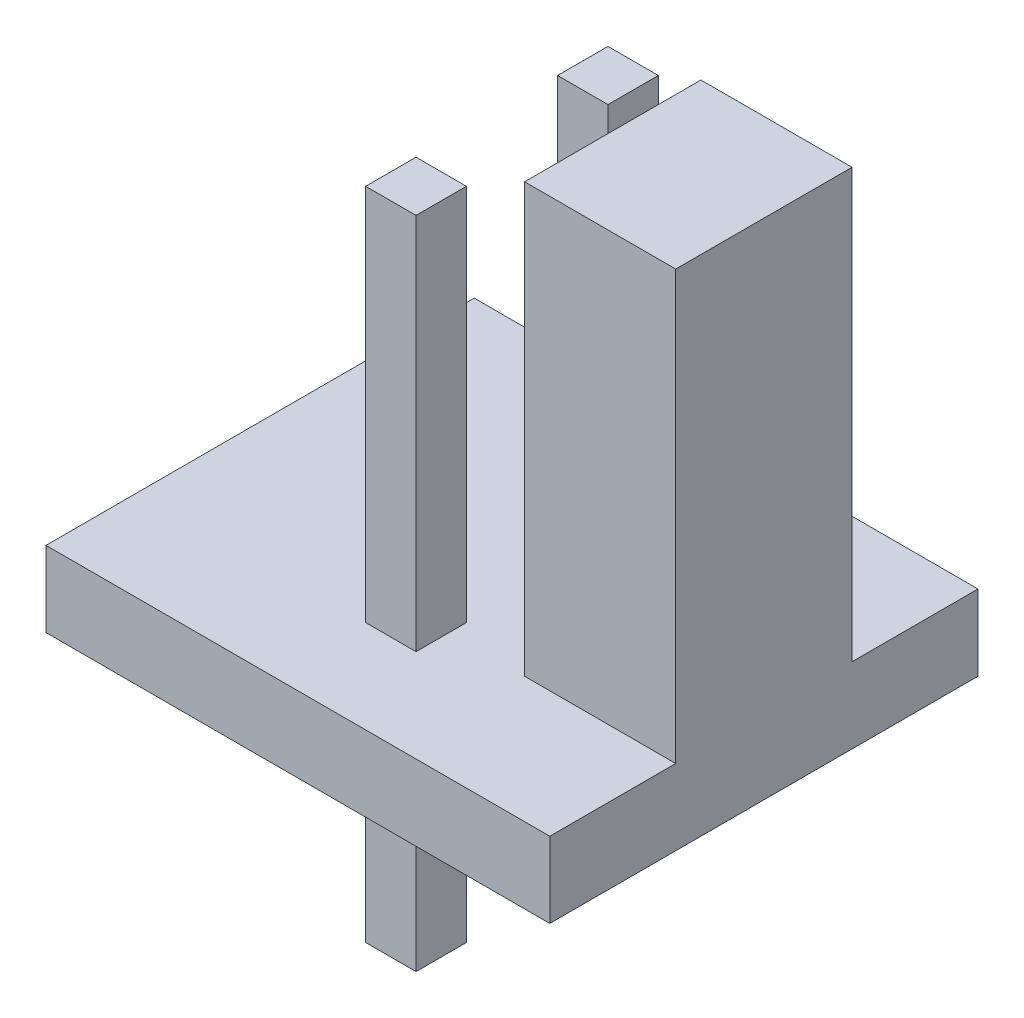
ISO-10303-21;
HEADER;
FILE_DESCRIPTION(('STEP AP214'),'2;1');
FILE_NAME('part.step','',(''),(''),'','','');
FILE_SCHEMA(('AUTOMOTIVE_DESIGN { 1 0 10303 214 1 1 1 1 }'));
ENDSEC;
DATA;
#1=APPLICATION_CONTEXT('core data for automotive mechanical design processes');
#2=APPLICATION_PROTOCOL_DEFINITION('international standard','automotive_design',2000,#1);
#3=PRODUCT_CONTEXT('',#1,'mechanical');
#4=PRODUCT('Part','Part','',(#3));
#5=PRODUCT_RELATED_PRODUCT_CATEGORY('part','',(#4));
#6=PRODUCT_DEFINITION_FORMATION('','',#4);
#7=PRODUCT_DEFINITION_CONTEXT('part definition',#1,'design');
#8=PRODUCT_DEFINITION('design','',#6,#7);
#9=PRODUCT_DEFINITION_SHAPE('','',#8);
#10=(LENGTH_UNIT() NAMED_UNIT(*) SI_UNIT(.MILLI.,.METRE.));
#11=(NAMED_UNIT(*) PLANE_ANGLE_UNIT() SI_UNIT($,.RADIAN.));
#12=(NAMED_UNIT(*) SI_UNIT($,.STERADIAN.) SOLID_ANGLE_UNIT());
#13=UNCERTAINTY_MEASURE_WITH_UNIT(LENGTH_MEASURE(1.E-05),#10,'distance_accuracy_value','');
#14=(GEOMETRIC_REPRESENTATION_CONTEXT(3) GLOBAL_UNCERTAINTY_ASSIGNED_CONTEXT((#13)) GLOBAL_UNIT_ASSIGNED_CONTEXT((#10,
#11,#12)) REPRESENTATION_CONTEXT('',''));
#15=CARTESIAN_POINT('',(0.,0.,0.));
#16=DIRECTION('',(0.,0.,1.));
#17=DIRECTION('',(1.,0.,0.));
#18=AXIS2_PLACEMENT_3D('',#15,#16,#17);
#19=CARTESIAN_POINT('',(-5.,0.,4.25));
#20=DIRECTION('',(0.,1.,0.));
#21=DIRECTION('',(0.,0.,1.));
#22=AXIS2_PLACEMENT_3D('',#19,#20,#21);
#23=PLANE('',#22);
#24=DIRECTION('',(0.,0.,1.));
#25=VECTOR('',#24,1.);
#26=CARTESIAN_POINT('',(0.5,0.,4.25));
#27=LINE('',#26,#25);
#28=CARTESIAN_POINT('',(0.5,0.,1.405));
#29=VERTEX_POINT('',#28);
#30=CARTESIAN_POINT('',(0.5,0.,2.405));
#31=VERTEX_POINT('',#30);
#32=EDGE_CURVE('E300',#29,#31,#27,.T.);
#33=ORIENTED_EDGE('',*,*,#32,.F.);
#34=DIRECTION('',(1.,0.,0.));
#35=VECTOR('',#34,1.);
#36=CARTESIAN_POINT('',(-5.,0.,1.405));
#37=LINE('',#36,#35);
#38=CARTESIAN_POINT('',(-0.5,0.,1.405));
#39=VERTEX_POINT('',#38);
#40=EDGE_CURVE('E291',#39,#29,#37,.T.);
#41=ORIENTED_EDGE('',*,*,#40,.F.);
#42=DIRECTION('',(0.,0.,-1.));
#43=VECTOR('',#42,1.);
#44=CARTESIAN_POINT('',(-0.5,0.,4.25));
#45=LINE('',#44,#43);
#46=CARTESIAN_POINT('',(-0.5,0.,2.405));
#47=VERTEX_POINT('',#46);
#48=EDGE_CURVE('E294',#47,#39,#45,.T.);
#49=ORIENTED_EDGE('',*,*,#48,.F.);
#50=DIRECTION('',(-1.,0.,0.));
#51=VECTOR('',#50,1.);
#52=CARTESIAN_POINT('',(-5.,0.,2.405));
#53=LINE('',#52,#51);
#54=EDGE_CURVE('E297',#31,#47,#53,.T.);
#55=ORIENTED_EDGE('',*,*,#54,.F.);
#56=EDGE_LOOP('',(#33,#41,#49,#55));
#57=FACE_BOUND('',#56,.T.);
#58=DIRECTION('',(0.,0.,1.));
#59=VECTOR('',#58,1.);
#60=CARTESIAN_POINT('',(-5.,0.,-4.25));
#61=LINE('',#60,#59);
#62=CARTESIAN_POINT('',(-5.,0.,-4.25));
#63=VERTEX_POINT('',#62);
#64=CARTESIAN_POINT('',(-5.,0.,4.25));
#65=VERTEX_POINT('',#64);
#66=EDGE_CURVE('E341',#63,#65,#61,.T.);
#67=ORIENTED_EDGE('',*,*,#66,.F.);
#68=DIRECTION('',(-1.,0.,0.));
#69=VECTOR('',#68,1.);
#70=CARTESIAN_POINT('',(-5.,0.,-4.25));
#71=LINE('',#70,#69);
#72=CARTESIAN_POINT('',(5.,0.,-4.25));
#73=VERTEX_POINT('',#72);
#74=EDGE_CURVE('E346',#73,#63,#71,.T.);
#75=ORIENTED_EDGE('',*,*,#74,.F.);
#76=DIRECTION('',(0.,0.,-1.));
#77=VECTOR('',#76,1.);
#78=CARTESIAN_POINT('',(5.,0.,-4.25));
#79=LINE('',#78,#77);
#80=CARTESIAN_POINT('',(5.,0.,4.25));
#81=VERTEX_POINT('',#80);
#82=EDGE_CURVE('E352',#81,#73,#79,.T.);
#83=ORIENTED_EDGE('',*,*,#82,.F.);
#84=DIRECTION('',(1.,0.,0.));
#85=VECTOR('',#84,1.);
#86=CARTESIAN_POINT('',(-5.,0.,4.25));
#87=LINE('',#86,#85);
#88=EDGE_CURVE('E349',#65,#81,#87,.T.);
#89=ORIENTED_EDGE('',*,*,#88,.F.);
#90=EDGE_LOOP('',(#67,#75,#83,#89));
#91=FACE_BOUND('',#90,.T.);
#92=DIRECTION('',(1.,0.,0.));
#93=VECTOR('',#92,1.);
#94=CARTESIAN_POINT('',(-5.,0.,-2.405));
#95=LINE('',#94,#93);
#96=CARTESIAN_POINT('',(-0.499999999999999,0.,-2.405));
#97=VERTEX_POINT('',#96);
#98=CARTESIAN_POINT('',(0.500000000000001,0.,-2.405));
#99=VERTEX_POINT('',#98);
#100=EDGE_CURVE('E252',#97,#99,#95,.T.);
#101=ORIENTED_EDGE('',*,*,#100,.F.);
#102=DIRECTION('',(0.,0.,-1.));
#103=VECTOR('',#102,1.);
#104=CARTESIAN_POINT('',(-0.500000000000001,0.,4.25));
#105=LINE('',#104,#103);
#106=CARTESIAN_POINT('',(-0.499999999999999,0.,-1.405));
#107=VERTEX_POINT('',#106);
#108=EDGE_CURVE('E247',#107,#97,#105,.T.);
#109=ORIENTED_EDGE('',*,*,#108,.F.);
#110=DIRECTION('',(-1.,0.,0.));
#111=VECTOR('',#110,1.);
#112=CARTESIAN_POINT('',(-5.,0.,-1.405));
#113=LINE('',#112,#111);
#114=CARTESIAN_POINT('',(0.500000000000001,0.,-1.405));
#115=VERTEX_POINT('',#114);
#116=EDGE_CURVE('E57',#115,#107,#113,.T.);
#117=ORIENTED_EDGE('',*,*,#116,.F.);
#118=DIRECTION('',(0.,0.,1.));
#119=VECTOR('',#118,1.);
#120=CARTESIAN_POINT('',(0.500000000000002,0.,4.25));
#121=LINE('',#120,#119);
#122=EDGE_CURVE('E52',#99,#115,#121,.T.);
#123=ORIENTED_EDGE('',*,*,#122,.F.);
#124=EDGE_LOOP('',(#101,#109,#117,#123));
#125=FACE_BOUND('',#124,.T.);
#126=ADVANCED_FACE('F37',(#57,#91,#125),#23,.F.);
#127=CARTESIAN_POINT('',(-5.,1.5,4.25));
#128=DIRECTION('',(0.,1.,0.));
#129=DIRECTION('',(0.,0.,1.));
#130=AXIS2_PLACEMENT_3D('',#127,#128,#129);
#131=PLANE('',#130);
#132=DIRECTION('',(1.,0.,0.));
#133=VECTOR('',#132,1.);
#134=CARTESIAN_POINT('',(-5.,1.5,1.405));
#135=LINE('',#134,#133);
#136=CARTESIAN_POINT('',(-0.5,1.5,1.405));
#137=VERTEX_POINT('',#136);
#138=CARTESIAN_POINT('',(0.5,1.5,1.405));
#139=VERTEX_POINT('',#138);
#140=EDGE_CURVE('E364',#137,#139,#135,.T.);
#141=ORIENTED_EDGE('',*,*,#140,.T.);
#142=DIRECTION('',(0.,0.,1.));
#143=VECTOR('',#142,1.);
#144=CARTESIAN_POINT('',(0.5,1.5,4.25));
#145=LINE('',#144,#143);
#146=CARTESIAN_POINT('',(0.5,1.5,2.405));
#147=VERTEX_POINT('',#146);
#148=EDGE_CURVE('E373',#139,#147,#145,.T.);
#149=ORIENTED_EDGE('',*,*,#148,.T.);
#150=DIRECTION('',(-1.,0.,0.));
#151=VECTOR('',#150,1.);
#152=CARTESIAN_POINT('',(-5.,1.5,2.405));
#153=LINE('',#152,#151);
#154=CARTESIAN_POINT('',(-0.5,1.5,2.405));
#155=VERTEX_POINT('',#154);
#156=EDGE_CURVE('E370',#147,#155,#153,.T.);
#157=ORIENTED_EDGE('',*,*,#156,.T.);
#158=DIRECTION('',(0.,0.,-1.));
#159=VECTOR('',#158,1.);
#160=CARTESIAN_POINT('',(-0.5,1.5,4.25));
#161=LINE('',#160,#159);
#162=EDGE_CURVE('E367',#155,#137,#161,.T.);
#163=ORIENTED_EDGE('',*,*,#162,.T.);
#164=EDGE_LOOP('',(#141,#149,#157,#163));
#165=FACE_BOUND('',#164,.T.);
#166=DIRECTION('',(1.,0.,0.));
#167=VECTOR('',#166,1.);
#168=CARTESIAN_POINT('',(2.,1.5,1.75));
#169=LINE('',#168,#167);
#170=CARTESIAN_POINT('',(2.,1.5,1.75));
#171=VERTEX_POINT('',#170);
#172=CARTESIAN_POINT('',(5.,1.5,1.75));
#173=VERTEX_POINT('',#172);
#174=EDGE_CURVE('E322',#171,#173,#169,.T.);
#175=ORIENTED_EDGE('',*,*,#174,.F.);
#176=DIRECTION('',(0.,0.,1.));
#177=VECTOR('',#176,1.);
#178=CARTESIAN_POINT('',(2.,1.5,-1.75));
#179=LINE('',#178,#177);
#180=CARTESIAN_POINT('',(2.,1.5,-1.75));
#181=VERTEX_POINT('',#180);
#182=EDGE_CURVE('E324',#181,#171,#179,.T.);
#183=ORIENTED_EDGE('',*,*,#182,.F.);
#184=DIRECTION('',(-1.,0.,0.));
#185=VECTOR('',#184,1.);
#186=CARTESIAN_POINT('',(5.,1.5,-1.75));
#187=LINE('',#186,#185);
#188=CARTESIAN_POINT('',(5.,1.5,-1.75));
#189=VERTEX_POINT('',#188);
#190=EDGE_CURVE('E304',#189,#181,#187,.T.);
#191=ORIENTED_EDGE('',*,*,#190,.F.);
#192=DIRECTION('',(0.,0.,1.));
#193=VECTOR('',#192,1.);
#194=CARTESIAN_POINT('',(5.,1.5,-4.25));
#195=LINE('',#194,#193);
#196=CARTESIAN_POINT('',(5.,1.5,-4.25));
#197=VERTEX_POINT('',#196);
#198=EDGE_CURVE('E306',#197,#189,#195,.T.);
#199=ORIENTED_EDGE('',*,*,#198,.F.);
#200=DIRECTION('',(1.,0.,0.));
#201=VECTOR('',#200,1.);
#202=CARTESIAN_POINT('',(-5.,1.5,-4.25));
#203=LINE('',#202,#201);
#204=CARTESIAN_POINT('',(-5.,1.5,-4.25));
#205=VERTEX_POINT('',#204);
#206=EDGE_CURVE('E310',#205,#197,#203,.T.);
#207=ORIENTED_EDGE('',*,*,#206,.F.);
#208=DIRECTION('',(0.,0.,-1.));
#209=VECTOR('',#208,1.);
#210=CARTESIAN_POINT('',(-5.,1.5,4.25));
#211=LINE('',#210,#209);
#212=CARTESIAN_POINT('',(-5.,1.5,4.25));
#213=VERTEX_POINT('',#212);
#214=EDGE_CURVE('E313',#213,#205,#211,.T.);
#215=ORIENTED_EDGE('',*,*,#214,.F.);
#216=DIRECTION('',(-1.,0.,0.));
#217=VECTOR('',#216,1.);
#218=CARTESIAN_POINT('',(5.,1.5,4.25));
#219=LINE('',#218,#217);
#220=CARTESIAN_POINT('',(5.,1.5,4.25));
#221=VERTEX_POINT('',#220);
#222=EDGE_CURVE('E316',#221,#213,#219,.T.);
#223=ORIENTED_EDGE('',*,*,#222,.F.);
#224=DIRECTION('',(0.,0.,1.));
#225=VECTOR('',#224,1.);
#226=CARTESIAN_POINT('',(5.,1.5,1.75));
#227=LINE('',#226,#225);
#228=EDGE_CURVE('E319',#173,#221,#227,.T.);
#229=ORIENTED_EDGE('',*,*,#228,.F.);
#230=EDGE_LOOP('',(#175,#183,#191,#199,#207,#215,#223,#229));
#231=FACE_BOUND('',#230,.T.);
#232=DIRECTION('',(0.,0.,-1.));
#233=VECTOR('',#232,1.);
#234=CARTESIAN_POINT('',(-0.500000000000001,1.5,4.25));
#235=LINE('',#234,#233);
#236=CARTESIAN_POINT('',(-0.5,1.5,-1.405));
#237=VERTEX_POINT('',#236);
#238=CARTESIAN_POINT('',(-0.499999999999998,1.5,-2.405));
#239=VERTEX_POINT('',#238);
#240=EDGE_CURVE('E376',#237,#239,#235,.T.);
#241=ORIENTED_EDGE('',*,*,#240,.T.);
#242=DIRECTION('',(1.,0.,0.));
#243=VECTOR('',#242,1.);
#244=CARTESIAN_POINT('',(-5.,1.5,-2.405));
#245=LINE('',#244,#243);
#246=CARTESIAN_POINT('',(0.500000000000001,1.5,-2.405));
#247=VERTEX_POINT('',#246);
#248=EDGE_CURVE('E12',#239,#247,#245,.T.);
#249=ORIENTED_EDGE('',*,*,#248,.T.);
#250=DIRECTION('',(0.,0.,1.));
#251=VECTOR('',#250,1.);
#252=CARTESIAN_POINT('',(0.500000000000002,1.5,4.25));
#253=LINE('',#252,#251);
#254=CARTESIAN_POINT('',(0.500000000000001,1.5,-1.405));
#255=VERTEX_POINT('',#254);
#256=EDGE_CURVE('E45',#247,#255,#253,.T.);
#257=ORIENTED_EDGE('',*,*,#256,.T.);
#258=DIRECTION('',(-1.,0.,0.));
#259=VECTOR('',#258,1.);
#260=CARTESIAN_POINT('',(-5.,1.5,-1.405));
#261=LINE('',#260,#259);
#262=EDGE_CURVE('E202',#255,#237,#261,.T.);
#263=ORIENTED_EDGE('',*,*,#262,.T.);
#264=EDGE_LOOP('',(#241,#249,#257,#263));
#265=FACE_BOUND('',#264,.T.);
#266=ADVANCED_FACE('F380',(#165,#231,#265),#131,.T.);
#267=CARTESIAN_POINT('',(-5.,10.,-4.25));
#268=DIRECTION('',(1.,0.,0.));
#269=DIRECTION('',(0.,0.,-1.));
#270=AXIS2_PLACEMENT_3D('',#267,#268,#269);
#271=PLANE('',#270);
#272=ORIENTED_EDGE('',*,*,#214,.T.);
#273=DIRECTION('',(0.,-1.,0.));
#274=VECTOR('',#273,1.);
#275=CARTESIAN_POINT('',(-5.,10.,-4.25));
#276=LINE('',#275,#274);
#277=EDGE_CURVE('E345',#205,#63,#276,.T.);
#278=ORIENTED_EDGE('',*,*,#277,.T.);
#279=ORIENTED_EDGE('',*,*,#66,.T.);
#280=DIRECTION('',(0.,-1.,0.));
#281=VECTOR('',#280,1.);
#282=CARTESIAN_POINT('',(-5.,10.,4.25));
#283=LINE('',#282,#281);
#284=EDGE_CURVE('E362',#213,#65,#283,.T.);
#285=ORIENTED_EDGE('',*,*,#284,.F.);
#286=EDGE_LOOP('',(#272,#278,#279,#285));
#287=FACE_BOUND('',#286,.T.);
#288=ADVANCED_FACE('F39',(#287),#271,.F.);
#289=CARTESIAN_POINT('',(-5.,10.,4.25));
#290=DIRECTION('',(0.,0.,-1.));
#291=DIRECTION('',(-1.,0.,0.));
#292=AXIS2_PLACEMENT_3D('',#289,#290,#291);
#293=PLANE('',#292);
#294=ORIENTED_EDGE('',*,*,#222,.T.);
#295=ORIENTED_EDGE('',*,*,#284,.T.);
#296=ORIENTED_EDGE('',*,*,#88,.T.);
#297=DIRECTION('',(0.,-1.,0.));
#298=VECTOR('',#297,1.);
#299=CARTESIAN_POINT('',(5.,10.,4.25));
#300=LINE('',#299,#298);
#301=EDGE_CURVE('E360',#221,#81,#300,.T.);
#302=ORIENTED_EDGE('',*,*,#301,.F.);
#303=EDGE_LOOP('',(#294,#295,#296,#302));
#304=FACE_BOUND('',#303,.T.);
#305=ADVANCED_FACE('F418',(#304),#293,.F.);
#306=CARTESIAN_POINT('',(-5.,10.,-4.25));
#307=DIRECTION('',(0.,0.,1.));
#308=DIRECTION('',(1.,0.,0.));
#309=AXIS2_PLACEMENT_3D('',#306,#307,#308);
#310=PLANE('',#309);
#311=ORIENTED_EDGE('',*,*,#206,.T.);
#312=DIRECTION('',(0.,-1.,0.));
#313=VECTOR('',#312,1.);
#314=CARTESIAN_POINT('',(5.,10.,-4.25));
#315=LINE('',#314,#313);
#316=EDGE_CURVE('E358',#197,#73,#315,.T.);
#317=ORIENTED_EDGE('',*,*,#316,.T.);
#318=ORIENTED_EDGE('',*,*,#74,.T.);
#319=ORIENTED_EDGE('',*,*,#277,.F.);
#320=EDGE_LOOP('',(#311,#317,#318,#319));
#321=FACE_BOUND('',#320,.T.);
#322=ADVANCED_FACE('F414',(#321),#310,.F.);
#323=CARTESIAN_POINT('',(5.,10.,-4.25));
#324=DIRECTION('',(-1.,0.,0.));
#325=DIRECTION('',(0.,0.,1.));
#326=AXIS2_PLACEMENT_3D('',#323,#324,#325);
#327=PLANE('',#326);
#328=DIRECTION('',(0.,0.,-1.));
#329=VECTOR('',#328,1.);
#330=CARTESIAN_POINT('',(5.,10.,-4.25));
#331=LINE('',#330,#329);
#332=CARTESIAN_POINT('',(5.,10.,1.75));
#333=VERTEX_POINT('',#332);
#334=CARTESIAN_POINT('',(5.,10.,-1.75));
#335=VERTEX_POINT('',#334);
#336=EDGE_CURVE('E342',#333,#335,#331,.T.);
#337=ORIENTED_EDGE('',*,*,#336,.F.);
#338=DIRECTION('',(0.,1.,0.));
#339=VECTOR('',#338,1.);
#340=CARTESIAN_POINT('',(5.,-13.1244047484067,1.75));
#341=LINE('',#340,#339);
#342=EDGE_CURVE('E307',#173,#333,#341,.T.);
#343=ORIENTED_EDGE('',*,*,#342,.F.);
#344=ORIENTED_EDGE('',*,*,#228,.T.);
#345=ORIENTED_EDGE('',*,*,#301,.T.);
#346=ORIENTED_EDGE('',*,*,#82,.T.);
#347=ORIENTED_EDGE('',*,*,#316,.F.);
#348=ORIENTED_EDGE('',*,*,#198,.T.);
#349=DIRECTION('',(0.,1.,0.));
#350=VECTOR('',#349,1.);
#351=CARTESIAN_POINT('',(5.,-13.1244047484067,-1.75));
#352=LINE('',#351,#350);
#353=EDGE_CURVE('E333',#189,#335,#352,.T.);
#354=ORIENTED_EDGE('',*,*,#353,.T.);
#355=EDGE_LOOP('',(#337,#343,#344,#345,#346,#347,#348,#354));
#356=FACE_BOUND('',#355,.T.);
#357=ADVANCED_FACE('F417',(#356),#327,.F.);
#358=CARTESIAN_POINT('',(-5.,10.,4.25));
#359=DIRECTION('',(0.,1.,0.));
#360=DIRECTION('',(0.,0.,1.));
#361=AXIS2_PLACEMENT_3D('',#358,#359,#360);
#362=PLANE('',#361);
#363=DIRECTION('',(-1.,0.,0.));
#364=VECTOR('',#363,1.);
#365=CARTESIAN_POINT('',(2.,10.,1.75));
#366=LINE('',#365,#364);
#367=CARTESIAN_POINT('',(2.,10.,1.75));
#368=VERTEX_POINT('',#367);
#369=EDGE_CURVE('E303',#333,#368,#366,.T.);
#370=ORIENTED_EDGE('',*,*,#369,.F.);
#371=ORIENTED_EDGE('',*,*,#336,.T.);
#372=DIRECTION('',(1.,0.,0.));
#373=VECTOR('',#372,1.);
#374=CARTESIAN_POINT('',(5.,10.,-1.75));
#375=LINE('',#374,#373);
#376=CARTESIAN_POINT('',(2.,10.,-1.75));
#377=VERTEX_POINT('',#376);
#378=EDGE_CURVE('E329',#377,#335,#375,.T.);
#379=ORIENTED_EDGE('',*,*,#378,.F.);
#380=DIRECTION('',(0.,0.,-1.));
#381=VECTOR('',#380,1.);
#382=CARTESIAN_POINT('',(2.,10.,-1.75));
#383=LINE('',#382,#381);
#384=EDGE_CURVE('E326',#368,#377,#383,.T.);
#385=ORIENTED_EDGE('',*,*,#384,.F.);
#386=EDGE_LOOP('',(#370,#371,#379,#385));
#387=FACE_BOUND('',#386,.T.);
#388=ADVANCED_FACE('F412',(#387),#362,.T.);
#389=CARTESIAN_POINT('',(2.,-13.1244047484067,1.75));
#390=DIRECTION('',(0.,0.,-1.));
#391=DIRECTION('',(-1.,0.,0.));
#392=AXIS2_PLACEMENT_3D('',#389,#390,#391);
#393=PLANE('',#392);
#394=ORIENTED_EDGE('',*,*,#174,.T.);
#395=ORIENTED_EDGE('',*,*,#342,.T.);
#396=ORIENTED_EDGE('',*,*,#369,.T.);
#397=DIRECTION('',(0.,1.,0.));
#398=VECTOR('',#397,1.);
#399=CARTESIAN_POINT('',(2.,-13.1244047484067,1.75));
#400=LINE('',#399,#398);
#401=EDGE_CURVE('E331',#171,#368,#400,.T.);
#402=ORIENTED_EDGE('',*,*,#401,.F.);
#403=EDGE_LOOP('',(#394,#395,#396,#402));
#404=FACE_BOUND('',#403,.T.);
#405=ADVANCED_FACE('F444',(#404),#393,.F.);
#406=CARTESIAN_POINT('',(5.,-13.1244047484067,-1.75));
#407=DIRECTION('',(0.,0.,1.));
#408=DIRECTION('',(1.,0.,0.));
#409=AXIS2_PLACEMENT_3D('',#406,#407,#408);
#410=PLANE('',#409);
#411=ORIENTED_EDGE('',*,*,#190,.T.);
#412=DIRECTION('',(0.,1.,0.));
#413=VECTOR('',#412,1.);
#414=CARTESIAN_POINT('',(2.,-13.1244047484067,-1.75));
#415=LINE('',#414,#413);
#416=EDGE_CURVE('E336',#181,#377,#415,.T.);
#417=ORIENTED_EDGE('',*,*,#416,.T.);
#418=ORIENTED_EDGE('',*,*,#378,.T.);
#419=ORIENTED_EDGE('',*,*,#353,.F.);
#420=EDGE_LOOP('',(#411,#417,#418,#419));
#421=FACE_BOUND('',#420,.T.);
#422=ADVANCED_FACE('F454',(#421),#410,.F.);
#423=CARTESIAN_POINT('',(2.,-13.1244047484067,-1.75));
#424=DIRECTION('',(1.,0.,0.));
#425=DIRECTION('',(0.,0.,-1.));
#426=AXIS2_PLACEMENT_3D('',#423,#424,#425);
#427=PLANE('',#426);
#428=ORIENTED_EDGE('',*,*,#182,.T.);
#429=ORIENTED_EDGE('',*,*,#401,.T.);
#430=ORIENTED_EDGE('',*,*,#384,.T.);
#431=ORIENTED_EDGE('',*,*,#416,.F.);
#432=EDGE_LOOP('',(#428,#429,#430,#431));
#433=FACE_BOUND('',#432,.T.);
#434=ADVANCED_FACE('F448',(#433),#427,.F.);
#435=CARTESIAN_POINT('',(-5.,9.,4.25));
#436=DIRECTION('',(0.,1.,0.));
#437=DIRECTION('',(0.,0.,1.));
#438=AXIS2_PLACEMENT_3D('',#435,#436,#437);
#439=PLANE('',#438);
#440=DIRECTION('',(0.,0.,1.));
#441=VECTOR('',#440,1.);
#442=CARTESIAN_POINT('',(0.5,9.,2.405));
#443=LINE('',#442,#441);
#444=CARTESIAN_POINT('',(0.5,9.,1.405));
#445=VERTEX_POINT('',#444);
#446=CARTESIAN_POINT('',(0.5,9.,2.405));
#447=VERTEX_POINT('',#446);
#448=EDGE_CURVE('E258',#445,#447,#443,.T.);
#449=ORIENTED_EDGE('',*,*,#448,.F.);
#450=DIRECTION('',(1.,0.,0.));
#451=VECTOR('',#450,1.);
#452=CARTESIAN_POINT('',(0.5,9.,1.405));
#453=LINE('',#452,#451);
#454=CARTESIAN_POINT('',(-0.5,9.,1.405));
#455=VERTEX_POINT('',#454);
#456=EDGE_CURVE('E262',#455,#445,#453,.T.);
#457=ORIENTED_EDGE('',*,*,#456,.F.);
#458=DIRECTION('',(0.,0.,-1.));
#459=VECTOR('',#458,1.);
#460=CARTESIAN_POINT('',(-0.5,9.,2.405));
#461=LINE('',#460,#459);
#462=CARTESIAN_POINT('',(-0.5,9.,2.405));
#463=VERTEX_POINT('',#462);
#464=EDGE_CURVE('E257',#463,#455,#461,.T.);
#465=ORIENTED_EDGE('',*,*,#464,.F.);
#466=DIRECTION('',(-1.,0.,0.));
#467=VECTOR('',#466,1.);
#468=CARTESIAN_POINT('',(0.5,9.,2.405));
#469=LINE('',#468,#467);
#470=EDGE_CURVE('E254',#447,#463,#469,.T.);
#471=ORIENTED_EDGE('',*,*,#470,.F.);
#472=EDGE_LOOP('',(#449,#457,#465,#471));
#473=FACE_BOUND('',#472,.T.);
#474=ADVANCED_FACE('F461',(#473),#439,.T.);
#475=CARTESIAN_POINT('',(0.5,-4.,1.405));
#476=DIRECTION('',(0.,0.,1.));
#477=DIRECTION('',(1.,0.,0.));
#478=AXIS2_PLACEMENT_3D('',#475,#476,#477);
#479=PLANE('',#478);
#480=ORIENTED_EDGE('',*,*,#140,.F.);
#481=DIRECTION('',(0.,1.,0.));
#482=VECTOR('',#481,1.);
#483=CARTESIAN_POINT('',(-0.5,-4.,1.405));
#484=LINE('',#483,#482);
#485=EDGE_CURVE('E279',#137,#455,#484,.T.);
#486=ORIENTED_EDGE('',*,*,#485,.T.);
#487=ORIENTED_EDGE('',*,*,#456,.T.);
#488=DIRECTION('',(0.,1.,0.));
#489=VECTOR('',#488,1.);
#490=CARTESIAN_POINT('',(0.5,-4.,1.405));
#491=LINE('',#490,#489);
#492=EDGE_CURVE('E275',#139,#445,#491,.T.);
#493=ORIENTED_EDGE('',*,*,#492,.F.);
#494=EDGE_LOOP('',(#480,#486,#487,#493));
#495=FACE_BOUND('',#494,.T.);
#496=ADVANCED_FACE('F477',(#495),#479,.F.);
#497=CARTESIAN_POINT('',(-0.5,-4.,2.405));
#498=DIRECTION('',(1.,0.,0.));
#499=DIRECTION('',(0.,0.,-1.));
#500=AXIS2_PLACEMENT_3D('',#497,#498,#499);
#501=PLANE('',#500);
#502=ORIENTED_EDGE('',*,*,#162,.F.);
#503=DIRECTION('',(0.,1.,0.));
#504=VECTOR('',#503,1.);
#505=CARTESIAN_POINT('',(-0.5,-4.,2.405));
#506=LINE('',#505,#504);
#507=EDGE_CURVE('E283',#155,#463,#506,.T.);
#508=ORIENTED_EDGE('',*,*,#507,.T.);
#509=ORIENTED_EDGE('',*,*,#464,.T.);
#510=ORIENTED_EDGE('',*,*,#485,.F.);
#511=EDGE_LOOP('',(#502,#508,#509,#510));
#512=FACE_BOUND('',#511,.T.);
#513=ADVANCED_FACE('F472',(#512),#501,.F.);
#514=CARTESIAN_POINT('',(0.5,-4.,2.405));
#515=DIRECTION('',(0.,0.,-1.));
#516=DIRECTION('',(-1.,0.,0.));
#517=AXIS2_PLACEMENT_3D('',#514,#515,#516);
#518=PLANE('',#517);
#519=ORIENTED_EDGE('',*,*,#156,.F.);
#520=DIRECTION('',(0.,1.,0.));
#521=VECTOR('',#520,1.);
#522=CARTESIAN_POINT('',(0.5,-4.,2.405));
#523=LINE('',#522,#521);
#524=EDGE_CURVE('E287',#147,#447,#523,.T.);
#525=ORIENTED_EDGE('',*,*,#524,.T.);
#526=ORIENTED_EDGE('',*,*,#470,.T.);
#527=ORIENTED_EDGE('',*,*,#507,.F.);
#528=EDGE_LOOP('',(#519,#525,#526,#527));
#529=FACE_BOUND('',#528,.T.);
#530=ADVANCED_FACE('F468',(#529),#518,.F.);
#531=CARTESIAN_POINT('',(0.5,-4.,2.405));
#532=DIRECTION('',(-1.,0.,0.));
#533=DIRECTION('',(0.,0.,1.));
#534=AXIS2_PLACEMENT_3D('',#531,#532,#533);
#535=PLANE('',#534);
#536=ORIENTED_EDGE('',*,*,#148,.F.);
#537=ORIENTED_EDGE('',*,*,#492,.T.);
#538=ORIENTED_EDGE('',*,*,#448,.T.);
#539=ORIENTED_EDGE('',*,*,#524,.F.);
#540=EDGE_LOOP('',(#536,#537,#538,#539));
#541=FACE_BOUND('',#540,.T.);
#542=ADVANCED_FACE('F464',(#541),#535,.F.);
#543=CARTESIAN_POINT('',(0.5,-4.,1.405));
#544=VERTEX_POINT('',#543);
#545=EDGE_CURVE('E276',#544,#29,#491,.T.);
#546=ORIENTED_EDGE('',*,*,#545,.T.);
#547=ORIENTED_EDGE('',*,*,#32,.T.);
#548=CARTESIAN_POINT('',(0.5,-4.,2.405));
#549=VERTEX_POINT('',#548);
#550=EDGE_CURVE('E288',#549,#31,#523,.T.);
#551=ORIENTED_EDGE('',*,*,#550,.F.);
#552=DIRECTION('',(0.,0.,1.));
#553=VECTOR('',#552,1.);
#554=CARTESIAN_POINT('',(0.5,-4.,2.405));
#555=LINE('',#554,#553);
#556=EDGE_CURVE('E261',#544,#549,#555,.T.);
#557=ORIENTED_EDGE('',*,*,#556,.F.);
#558=EDGE_LOOP('',(#546,#547,#551,#557));
#559=FACE_BOUND('',#558,.T.);
#560=ADVANCED_FACE('F467',(#559),#535,.F.);
#561=ORIENTED_EDGE('',*,*,#550,.T.);
#562=ORIENTED_EDGE('',*,*,#54,.T.);
#563=CARTESIAN_POINT('',(-0.5,-4.,2.405));
#564=VERTEX_POINT('',#563);
#565=EDGE_CURVE('E284',#564,#47,#506,.T.);
#566=ORIENTED_EDGE('',*,*,#565,.F.);
#567=DIRECTION('',(-1.,0.,0.));
#568=VECTOR('',#567,1.);
#569=CARTESIAN_POINT('',(0.5,-4.,2.405));
#570=LINE('',#569,#568);
#571=EDGE_CURVE('E269',#549,#564,#570,.T.);
#572=ORIENTED_EDGE('',*,*,#571,.F.);
#573=EDGE_LOOP('',(#561,#562,#566,#572));
#574=FACE_BOUND('',#573,.T.);
#575=ADVANCED_FACE('F474',(#574),#518,.F.);
#576=ORIENTED_EDGE('',*,*,#565,.T.);
#577=ORIENTED_EDGE('',*,*,#48,.T.);
#578=CARTESIAN_POINT('',(-0.5,-4.,1.405));
#579=VERTEX_POINT('',#578);
#580=EDGE_CURVE('E280',#579,#39,#484,.T.);
#581=ORIENTED_EDGE('',*,*,#580,.F.);
#582=DIRECTION('',(0.,0.,-1.));
#583=VECTOR('',#582,1.);
#584=CARTESIAN_POINT('',(-0.5,-4.,2.405));
#585=LINE('',#584,#583);
#586=EDGE_CURVE('E271',#564,#579,#585,.T.);
#587=ORIENTED_EDGE('',*,*,#586,.F.);
#588=EDGE_LOOP('',(#576,#577,#581,#587));
#589=FACE_BOUND('',#588,.T.);
#590=ADVANCED_FACE('F479',(#589),#501,.F.);
#591=ORIENTED_EDGE('',*,*,#580,.T.);
#592=ORIENTED_EDGE('',*,*,#40,.T.);
#593=ORIENTED_EDGE('',*,*,#545,.F.);
#594=DIRECTION('',(1.,0.,0.));
#595=VECTOR('',#594,1.);
#596=CARTESIAN_POINT('',(0.5,-4.,1.405));
#597=LINE('',#596,#595);
#598=EDGE_CURVE('E273',#579,#544,#597,.T.);
#599=ORIENTED_EDGE('',*,*,#598,.F.);
#600=EDGE_LOOP('',(#591,#592,#593,#599));
#601=FACE_BOUND('',#600,.T.);
#602=ADVANCED_FACE('F483',(#601),#479,.F.);
#603=CARTESIAN_POINT('',(0.5,-4.,1.405));
#604=DIRECTION('',(0.,1.,0.));
#605=DIRECTION('',(0.,0.,1.));
#606=AXIS2_PLACEMENT_3D('',#603,#604,#605);
#607=PLANE('',#606);
#608=ORIENTED_EDGE('',*,*,#556,.T.);
#609=ORIENTED_EDGE('',*,*,#571,.T.);
#610=ORIENTED_EDGE('',*,*,#586,.T.);
#611=ORIENTED_EDGE('',*,*,#598,.T.);
#612=EDGE_LOOP('',(#608,#609,#610,#611));
#613=FACE_BOUND('',#612,.T.);
#614=ADVANCED_FACE('F395',(#613),#607,.F.);
#615=CARTESIAN_POINT('',(-5.,9.,4.25));
#616=DIRECTION('',(0.,1.,0.));
#617=DIRECTION('',(0.,0.,1.));
#618=AXIS2_PLACEMENT_3D('',#615,#616,#617);
#619=PLANE('',#618);
#620=DIRECTION('',(1.,0.,0.));
#621=VECTOR('',#620,1.);
#622=CARTESIAN_POINT('',(0.500000000000001,9.,-2.405));
#623=LINE('',#622,#621);
#624=CARTESIAN_POINT('',(-0.499999999999999,9.,-2.405));
#625=VERTEX_POINT('',#624);
#626=CARTESIAN_POINT('',(0.500000000000001,9.,-2.405));
#627=VERTEX_POINT('',#626);
#628=EDGE_CURVE('E224',#625,#627,#623,.T.);
#629=ORIENTED_EDGE('',*,*,#628,.F.);
#630=DIRECTION('',(0.,0.,-1.));
#631=VECTOR('',#630,1.);
#632=CARTESIAN_POINT('',(-0.499999999999999,9.,-2.405));
#633=LINE('',#632,#631);
#634=CARTESIAN_POINT('',(-0.5,9.,-1.405));
#635=VERTEX_POINT('',#634);
#636=EDGE_CURVE('E217',#635,#625,#633,.T.);
#637=ORIENTED_EDGE('',*,*,#636,.F.);
#638=DIRECTION('',(-1.,0.,0.));
#639=VECTOR('',#638,1.);
#640=CARTESIAN_POINT('',(0.500000000000001,9.,-1.405));
#641=LINE('',#640,#639);
#642=CARTESIAN_POINT('',(0.500000000000001,9.,-1.405));
#643=VERTEX_POINT('',#642);
#644=EDGE_CURVE('E200',#643,#635,#641,.T.);
#645=ORIENTED_EDGE('',*,*,#644,.F.);
#646=DIRECTION('',(0.,0.,1.));
#647=VECTOR('',#646,1.);
#648=CARTESIAN_POINT('',(0.500000000000001,9.,-2.405));
#649=LINE('',#648,#647);
#650=EDGE_CURVE('E214',#627,#643,#649,.T.);
#651=ORIENTED_EDGE('',*,*,#650,.F.);
#652=EDGE_LOOP('',(#629,#637,#645,#651));
#653=FACE_BOUND('',#652,.T.);
#654=ADVANCED_FACE('F213',(#653),#619,.T.);
#655=CARTESIAN_POINT('',(-0.499999999999999,-4.,-2.405));
#656=DIRECTION('',(1.,0.,0.));
#657=DIRECTION('',(0.,0.,-1.));
#658=AXIS2_PLACEMENT_3D('',#655,#656,#657);
#659=PLANE('',#658);
#660=ORIENTED_EDGE('',*,*,#240,.F.);
#661=DIRECTION('',(0.,1.,0.));
#662=VECTOR('',#661,1.);
#663=CARTESIAN_POINT('',(-0.5,-4.,-1.405));
#664=LINE('',#663,#662);
#665=EDGE_CURVE('E240',#237,#635,#664,.T.);
#666=ORIENTED_EDGE('',*,*,#665,.T.);
#667=ORIENTED_EDGE('',*,*,#636,.T.);
#668=DIRECTION('',(0.,1.,0.));
#669=VECTOR('',#668,1.);
#670=CARTESIAN_POINT('',(-0.499999999999999,-4.,-2.405));
#671=LINE('',#670,#669);
#672=EDGE_CURVE('E236',#239,#625,#671,.T.);
#673=ORIENTED_EDGE('',*,*,#672,.F.);
#674=EDGE_LOOP('',(#660,#666,#667,#673));
#675=FACE_BOUND('',#674,.T.);
#676=ADVANCED_FACE('F385',(#675),#659,.F.);
#677=CARTESIAN_POINT('',(0.500000000000001,-4.,-1.405));
#678=DIRECTION('',(0.,0.,-1.));
#679=DIRECTION('',(-1.,0.,0.));
#680=AXIS2_PLACEMENT_3D('',#677,#678,#679);
#681=PLANE('',#680);
#682=ORIENTED_EDGE('',*,*,#262,.F.);
#683=DIRECTION('',(0.,1.,0.));
#684=VECTOR('',#683,1.);
#685=CARTESIAN_POINT('',(0.500000000000001,-4.,-1.405));
#686=LINE('',#685,#684);
#687=EDGE_CURVE('E196',#255,#643,#686,.T.);
#688=ORIENTED_EDGE('',*,*,#687,.T.);
#689=ORIENTED_EDGE('',*,*,#644,.T.);
#690=ORIENTED_EDGE('',*,*,#665,.F.);
#691=EDGE_LOOP('',(#682,#688,#689,#690));
#692=FACE_BOUND('',#691,.T.);
#693=ADVANCED_FACE('F198',(#692),#681,.F.);
#694=CARTESIAN_POINT('',(0.500000000000001,-4.,-2.405));
#695=DIRECTION('',(-1.,0.,0.));
#696=DIRECTION('',(0.,0.,1.));
#697=AXIS2_PLACEMENT_3D('',#694,#695,#696);
#698=PLANE('',#697);
#699=ORIENTED_EDGE('',*,*,#256,.F.);
#700=DIRECTION('',(0.,1.,0.));
#701=VECTOR('',#700,1.);
#702=CARTESIAN_POINT('',(0.500000000000001,-4.,-2.405));
#703=LINE('',#702,#701);
#704=EDGE_CURVE('E221',#247,#627,#703,.T.);
#705=ORIENTED_EDGE('',*,*,#704,.T.);
#706=ORIENTED_EDGE('',*,*,#650,.T.);
#707=ORIENTED_EDGE('',*,*,#687,.F.);
#708=EDGE_LOOP('',(#699,#705,#706,#707));
#709=FACE_BOUND('',#708,.T.);
#710=ADVANCED_FACE('F219',(#709),#698,.F.);
#711=CARTESIAN_POINT('',(0.500000000000001,-4.,-2.405));
#712=DIRECTION('',(0.,0.,1.));
#713=DIRECTION('',(1.,0.,0.));
#714=AXIS2_PLACEMENT_3D('',#711,#712,#713);
#715=PLANE('',#714);
#716=ORIENTED_EDGE('',*,*,#248,.F.);
#717=ORIENTED_EDGE('',*,*,#672,.T.);
#718=ORIENTED_EDGE('',*,*,#628,.T.);
#719=ORIENTED_EDGE('',*,*,#704,.F.);
#720=EDGE_LOOP('',(#716,#717,#718,#719));
#721=FACE_BOUND('',#720,.T.);
#722=ADVANCED_FACE('F383',(#721),#715,.F.);
#723=CARTESIAN_POINT('',(-0.499999999999999,-4.,-2.405));
#724=VERTEX_POINT('',#723);
#725=EDGE_CURVE('E237',#724,#97,#671,.T.);
#726=ORIENTED_EDGE('',*,*,#725,.T.);
#727=ORIENTED_EDGE('',*,*,#100,.T.);
#728=CARTESIAN_POINT('',(0.500000000000001,-4.,-2.405));
#729=VERTEX_POINT('',#728);
#730=EDGE_CURVE('E244',#729,#99,#703,.T.);
#731=ORIENTED_EDGE('',*,*,#730,.F.);
#732=DIRECTION('',(1.,0.,0.));
#733=VECTOR('',#732,1.);
#734=CARTESIAN_POINT('',(0.500000000000001,-4.,-2.405));
#735=LINE('',#734,#733);
#736=EDGE_CURVE('E226',#724,#729,#735,.T.);
#737=ORIENTED_EDGE('',*,*,#736,.F.);
#738=EDGE_LOOP('',(#726,#727,#731,#737));
#739=FACE_BOUND('',#738,.T.);
#740=ADVANCED_FACE('F492',(#739),#715,.F.);
#741=ORIENTED_EDGE('',*,*,#730,.T.);
#742=ORIENTED_EDGE('',*,*,#122,.T.);
#743=CARTESIAN_POINT('',(0.500000000000001,-4.,-1.405));
#744=VERTEX_POINT('',#743);
#745=EDGE_CURVE('E206',#744,#115,#686,.T.);
#746=ORIENTED_EDGE('',*,*,#745,.F.);
#747=DIRECTION('',(0.,0.,1.));
#748=VECTOR('',#747,1.);
#749=CARTESIAN_POINT('',(0.500000000000001,-4.,-2.405));
#750=LINE('',#749,#748);
#751=EDGE_CURVE('E230',#729,#744,#750,.T.);
#752=ORIENTED_EDGE('',*,*,#751,.F.);
#753=EDGE_LOOP('',(#741,#742,#746,#752));
#754=FACE_BOUND('',#753,.T.);
#755=ADVANCED_FACE('F494',(#754),#698,.F.);
#756=ORIENTED_EDGE('',*,*,#745,.T.);
#757=ORIENTED_EDGE('',*,*,#116,.T.);
#758=CARTESIAN_POINT('',(-0.5,-4.,-1.405));
#759=VERTEX_POINT('',#758);
#760=EDGE_CURVE('E207',#759,#107,#664,.T.);
#761=ORIENTED_EDGE('',*,*,#760,.F.);
#762=DIRECTION('',(-1.,0.,0.));
#763=VECTOR('',#762,1.);
#764=CARTESIAN_POINT('',(0.500000000000001,-4.,-1.405));
#765=LINE('',#764,#763);
#766=EDGE_CURVE('E232',#744,#759,#765,.T.);
#767=ORIENTED_EDGE('',*,*,#766,.F.);
#768=EDGE_LOOP('',(#756,#757,#761,#767));
#769=FACE_BOUND('',#768,.T.);
#770=ADVANCED_FACE('F394',(#769),#681,.F.);
#771=ORIENTED_EDGE('',*,*,#760,.T.);
#772=ORIENTED_EDGE('',*,*,#108,.T.);
#773=ORIENTED_EDGE('',*,*,#725,.F.);
#774=DIRECTION('',(0.,0.,-1.));
#775=VECTOR('',#774,1.);
#776=CARTESIAN_POINT('',(-0.499999999999999,-4.,-2.405));
#777=LINE('',#776,#775);
#778=EDGE_CURVE('E234',#759,#724,#777,.T.);
#779=ORIENTED_EDGE('',*,*,#778,.F.);
#780=EDGE_LOOP('',(#771,#772,#773,#779));
#781=FACE_BOUND('',#780,.T.);
#782=ADVANCED_FACE('F388',(#781),#659,.F.);
#783=CARTESIAN_POINT('',(0.500000000000001,-4.,-2.405));
#784=DIRECTION('',(0.,1.,0.));
#785=DIRECTION('',(0.,0.,1.));
#786=AXIS2_PLACEMENT_3D('',#783,#784,#785);
#787=PLANE('',#786);
#788=ORIENTED_EDGE('',*,*,#736,.T.);
#789=ORIENTED_EDGE('',*,*,#751,.T.);
#790=ORIENTED_EDGE('',*,*,#766,.T.);
#791=ORIENTED_EDGE('',*,*,#778,.T.);
#792=EDGE_LOOP('',(#788,#789,#790,#791));
#793=FACE_BOUND('',#792,.T.);
#794=ADVANCED_FACE('F399',(#793),#787,.F.);
#795=CLOSED_SHELL('',(#126,#266,#288,#305,#322,#357,#388,#405,#422,#434,#474,#496,#513,#530,
#542,#560,#575,#590,#602,#614,#654,#676,#693,#710,#722,#740,#755,#770,#782,#794));
#796=MANIFOLD_SOLID_BREP('B2',#795);
#797=ADVANCED_BREP_SHAPE_REPRESENTATION('',(#18,#796),#14);
#798=SHAPE_DEFINITION_REPRESENTATION(#9,#797);
ENDSEC;
END-ISO-10303-21;
